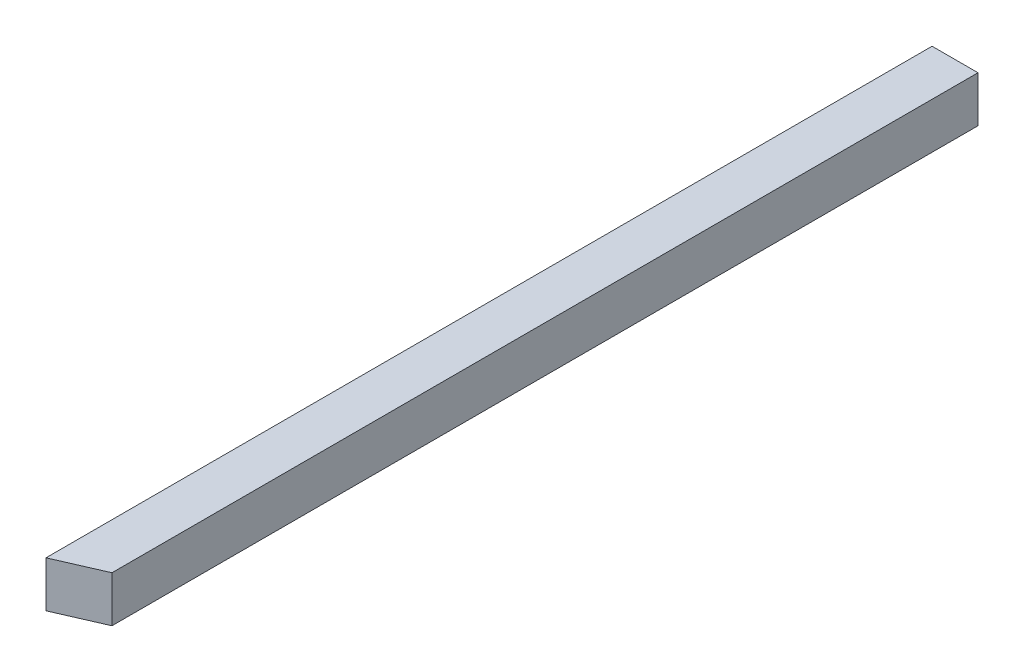
ISO-10303-21;
HEADER;
FILE_DESCRIPTION(('STEP AP214'),'2;1');
FILE_NAME('part.step','',(''),(''),'','','');
FILE_SCHEMA(('AUTOMOTIVE_DESIGN { 1 0 10303 214 1 1 1 1 }'));
ENDSEC;
DATA;
#1=APPLICATION_CONTEXT('core data for automotive mechanical design processes');
#2=APPLICATION_PROTOCOL_DEFINITION('international standard','automotive_design',2000,#1);
#3=PRODUCT_CONTEXT('',#1,'mechanical');
#4=PRODUCT('Part','Part','',(#3));
#5=PRODUCT_RELATED_PRODUCT_CATEGORY('part','',(#4));
#6=PRODUCT_DEFINITION_FORMATION('','',#4);
#7=PRODUCT_DEFINITION_CONTEXT('part definition',#1,'design');
#8=PRODUCT_DEFINITION('design','',#6,#7);
#9=PRODUCT_DEFINITION_SHAPE('','',#8);
#10=(LENGTH_UNIT() NAMED_UNIT(*) SI_UNIT(.MILLI.,.METRE.));
#11=(NAMED_UNIT(*) PLANE_ANGLE_UNIT() SI_UNIT($,.RADIAN.));
#12=(NAMED_UNIT(*) SI_UNIT($,.STERADIAN.) SOLID_ANGLE_UNIT());
#13=UNCERTAINTY_MEASURE_WITH_UNIT(LENGTH_MEASURE(1.E-05),#10,'distance_accuracy_value','');
#14=(GEOMETRIC_REPRESENTATION_CONTEXT(3) GLOBAL_UNCERTAINTY_ASSIGNED_CONTEXT((#13)) GLOBAL_UNIT_ASSIGNED_CONTEXT((#10,
#11,#12)) REPRESENTATION_CONTEXT('',''));
#15=CARTESIAN_POINT('',(0.,0.,0.));
#16=DIRECTION('',(0.,0.,1.));
#17=DIRECTION('',(1.,0.,0.));
#18=AXIS2_PLACEMENT_3D('',#15,#16,#17);
#19=CARTESIAN_POINT('',(0.,0.,300.));
#20=DIRECTION('',(1.,0.,0.));
#21=DIRECTION('',(0.,1.,0.));
#22=AXIS2_PLACEMENT_3D('',#19,#20,#21);
#23=PLANE('',#22);
#24=DIRECTION('',(0.,0.,-1.));
#25=VECTOR('',#24,1.);
#26=CARTESIAN_POINT('',(0.,-10.,300.));
#27=LINE('',#26,#25);
#28=CARTESIAN_POINT('',(0.,-10.,192.908466216439));
#29=VERTEX_POINT('',#28);
#30=CARTESIAN_POINT('',(0.,-10.,0.));
#31=VERTEX_POINT('',#30);
#32=EDGE_CURVE('E11',#29,#31,#27,.T.);
#33=ORIENTED_EDGE('',*,*,#32,.F.);
#34=DIRECTION('',(0.,-1.,0.));
#35=VECTOR('',#34,1.);
#36=CARTESIAN_POINT('',(0.,0.,192.908466216439));
#37=LINE('',#36,#35);
#38=CARTESIAN_POINT('',(0.,0.,192.908466216439));
#39=VERTEX_POINT('',#38);
#40=EDGE_CURVE('E73',#39,#29,#37,.T.);
#41=ORIENTED_EDGE('',*,*,#40,.F.);
#42=DIRECTION('',(0.,0.,-1.));
#43=VECTOR('',#42,1.);
#44=CARTESIAN_POINT('',(0.,0.,300.));
#45=LINE('',#44,#43);
#46=CARTESIAN_POINT('',(0.,0.,0.));
#47=VERTEX_POINT('',#46);
#48=EDGE_CURVE('E55',#39,#47,#45,.T.);
#49=ORIENTED_EDGE('',*,*,#48,.T.);
#50=DIRECTION('',(0.,-1.,0.));
#51=VECTOR('',#50,1.);
#52=CARTESIAN_POINT('',(0.,0.,0.));
#53=LINE('',#52,#51);
#54=EDGE_CURVE('E101',#47,#31,#53,.T.);
#55=ORIENTED_EDGE('',*,*,#54,.T.);
#56=EDGE_LOOP('',(#33,#41,#49,#55));
#57=FACE_BOUND('',#56,.T.);
#58=ADVANCED_FACE('F33',(#57),#23,.F.);
#59=CARTESIAN_POINT('',(0.,-10.,300.));
#60=DIRECTION('',(0.,1.,0.));
#61=DIRECTION('',(0.,0.,1.));
#62=AXIS2_PLACEMENT_3D('',#59,#60,#61);
#63=PLANE('',#62);
#64=DIRECTION('',(0.,0.,-1.));
#65=VECTOR('',#64,1.);
#66=CARTESIAN_POINT('',(10.,-10.,300.));
#67=LINE('',#66,#65);
#68=CARTESIAN_POINT('',(10.,-10.,188.546655864259));
#69=VERTEX_POINT('',#68);
#70=CARTESIAN_POINT('',(10.,-10.,0.));
#71=VERTEX_POINT('',#70);
#72=EDGE_CURVE('E40',#69,#71,#67,.T.);
#73=ORIENTED_EDGE('',*,*,#72,.F.);
#74=DIRECTION('',(-0.916600720401534,0.,0.39980385110625));
#75=VECTOR('',#74,1.);
#76=CARTESIAN_POINT('',(-39.2448167958352,-10.,210.026311033384));
#77=LINE('',#76,#75);
#78=EDGE_CURVE('E106',#69,#29,#77,.T.);
#79=ORIENTED_EDGE('',*,*,#78,.T.);
#80=ORIENTED_EDGE('',*,*,#32,.T.);
#81=DIRECTION('',(1.,0.,0.));
#82=VECTOR('',#81,1.);
#83=CARTESIAN_POINT('',(0.,-10.,0.));
#84=LINE('',#83,#82);
#85=EDGE_CURVE('E98',#31,#71,#84,.T.);
#86=ORIENTED_EDGE('',*,*,#85,.T.);
#87=EDGE_LOOP('',(#73,#79,#80,#86));
#88=FACE_BOUND('',#87,.T.);
#89=ADVANCED_FACE('F99',(#88),#63,.F.);
#90=CARTESIAN_POINT('',(10.,0.,300.));
#91=DIRECTION('',(-1.,0.,0.));
#92=DIRECTION('',(0.,-1.,0.));
#93=AXIS2_PLACEMENT_3D('',#90,#91,#92);
#94=PLANE('',#93);
#95=DIRECTION('',(0.,0.,-1.));
#96=VECTOR('',#95,1.);
#97=CARTESIAN_POINT('',(10.,0.,300.));
#98=LINE('',#97,#96);
#99=CARTESIAN_POINT('',(10.,0.,188.546655864259));
#100=VERTEX_POINT('',#99);
#101=CARTESIAN_POINT('',(10.,0.,0.));
#102=VERTEX_POINT('',#101);
#103=EDGE_CURVE('E84',#100,#102,#98,.T.);
#104=ORIENTED_EDGE('',*,*,#103,.F.);
#105=DIRECTION('',(0.,-1.,0.));
#106=VECTOR('',#105,1.);
#107=CARTESIAN_POINT('',(10.,0.,188.546655864259));
#108=LINE('',#107,#106);
#109=EDGE_CURVE('E47',#100,#69,#108,.T.);
#110=ORIENTED_EDGE('',*,*,#109,.T.);
#111=ORIENTED_EDGE('',*,*,#72,.T.);
#112=DIRECTION('',(0.,1.,0.));
#113=VECTOR('',#112,1.);
#114=CARTESIAN_POINT('',(10.,0.,0.));
#115=LINE('',#114,#113);
#116=EDGE_CURVE('E87',#71,#102,#115,.T.);
#117=ORIENTED_EDGE('',*,*,#116,.T.);
#118=EDGE_LOOP('',(#104,#110,#111,#117));
#119=FACE_BOUND('',#118,.T.);
#120=ADVANCED_FACE('F94',(#119),#94,.F.);
#121=CARTESIAN_POINT('',(0.,0.,300.));
#122=DIRECTION('',(0.,-1.,0.));
#123=DIRECTION('',(0.,0.,-1.));
#124=AXIS2_PLACEMENT_3D('',#121,#122,#123);
#125=PLANE('',#124);
#126=ORIENTED_EDGE('',*,*,#48,.F.);
#127=DIRECTION('',(0.916600720401534,0.,-0.39980385110625));
#128=VECTOR('',#127,1.);
#129=CARTESIAN_POINT('',(0.,0.,192.908466216439));
#130=LINE('',#129,#128);
#131=EDGE_CURVE('E71',#39,#100,#130,.T.);
#132=ORIENTED_EDGE('',*,*,#131,.T.);
#133=ORIENTED_EDGE('',*,*,#103,.T.);
#134=DIRECTION('',(-1.,0.,0.));
#135=VECTOR('',#134,1.);
#136=CARTESIAN_POINT('',(0.,0.,0.));
#137=LINE('',#136,#135);
#138=EDGE_CURVE('E82',#102,#47,#137,.T.);
#139=ORIENTED_EDGE('',*,*,#138,.T.);
#140=EDGE_LOOP('',(#126,#132,#133,#139));
#141=FACE_BOUND('',#140,.T.);
#142=ADVANCED_FACE('F80',(#141),#125,.F.);
#143=CARTESIAN_POINT('',(0.,0.,0.));
#144=DIRECTION('',(0.,0.,1.));
#145=DIRECTION('',(1.,0.,0.));
#146=AXIS2_PLACEMENT_3D('',#143,#144,#145);
#147=PLANE('',#146);
#148=ORIENTED_EDGE('',*,*,#54,.F.);
#149=ORIENTED_EDGE('',*,*,#138,.F.);
#150=ORIENTED_EDGE('',*,*,#116,.F.);
#151=ORIENTED_EDGE('',*,*,#85,.F.);
#152=EDGE_LOOP('',(#148,#149,#150,#151));
#153=FACE_BOUND('',#152,.T.);
#154=ADVANCED_FACE('F103',(#153),#147,.F.);
#155=CARTESIAN_POINT('',(0.,0.,192.908466216439));
#156=DIRECTION('',(-0.39980385110625,0.,-0.916600720401534));
#157=DIRECTION('',(-0.916600720401534,0.,0.39980385110625));
#158=AXIS2_PLACEMENT_3D('',#155,#156,#157);
#159=PLANE('',#158);
#160=ORIENTED_EDGE('',*,*,#109,.F.);
#161=ORIENTED_EDGE('',*,*,#131,.F.);
#162=ORIENTED_EDGE('',*,*,#40,.T.);
#163=ORIENTED_EDGE('',*,*,#78,.F.);
#164=EDGE_LOOP('',(#160,#161,#162,#163));
#165=FACE_BOUND('',#164,.T.);
#166=ADVANCED_FACE('F72',(#165),#159,.F.);
#167=CLOSED_SHELL('',(#58,#89,#120,#142,#154,#166));
#168=MANIFOLD_SOLID_BREP('B2',#167);
#169=ADVANCED_BREP_SHAPE_REPRESENTATION('',(#18,#168),#14);
#170=SHAPE_DEFINITION_REPRESENTATION(#9,#169);
ENDSEC;
END-ISO-10303-21;
